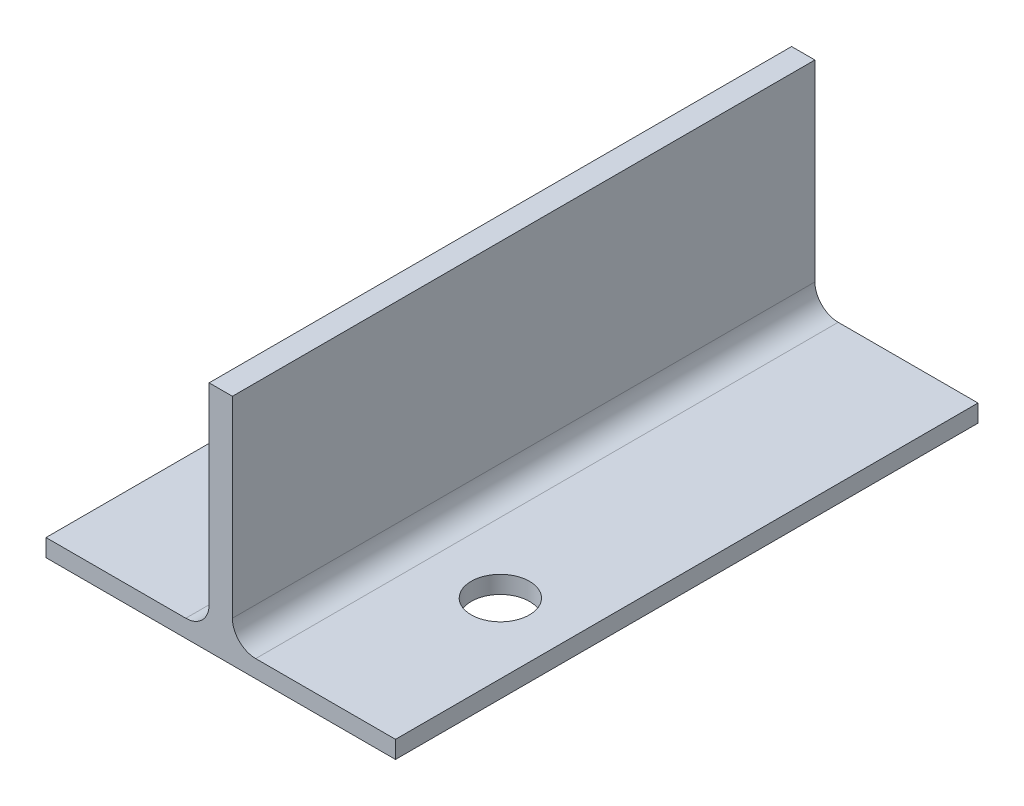
ISO-10303-21;
HEADER;
FILE_DESCRIPTION(('STEP AP214'),'2;1');
FILE_NAME('part.step','',(''),(''),'','','');
FILE_SCHEMA(('AUTOMOTIVE_DESIGN { 1 0 10303 214 1 1 1 1 }'));
ENDSEC;
DATA;
#1=APPLICATION_CONTEXT('core data for automotive mechanical design processes');
#2=APPLICATION_PROTOCOL_DEFINITION('international standard','automotive_design',2000,#1);
#3=PRODUCT_CONTEXT('',#1,'mechanical');
#4=PRODUCT('Part','Part','',(#3));
#5=PRODUCT_RELATED_PRODUCT_CATEGORY('part','',(#4));
#6=PRODUCT_DEFINITION_FORMATION('','',#4);
#7=PRODUCT_DEFINITION_CONTEXT('part definition',#1,'design');
#8=PRODUCT_DEFINITION('design','',#6,#7);
#9=PRODUCT_DEFINITION_SHAPE('','',#8);
#10=(LENGTH_UNIT() NAMED_UNIT(*) SI_UNIT(.MILLI.,.METRE.));
#11=(NAMED_UNIT(*) PLANE_ANGLE_UNIT() SI_UNIT($,.RADIAN.));
#12=(NAMED_UNIT(*) SI_UNIT($,.STERADIAN.) SOLID_ANGLE_UNIT());
#13=UNCERTAINTY_MEASURE_WITH_UNIT(LENGTH_MEASURE(1.E-05),#10,'distance_accuracy_value','');
#14=(GEOMETRIC_REPRESENTATION_CONTEXT(3) GLOBAL_UNCERTAINTY_ASSIGNED_CONTEXT((#13)) GLOBAL_UNIT_ASSIGNED_CONTEXT((#10,
#11,#12)) REPRESENTATION_CONTEXT('',''));
#15=CARTESIAN_POINT('',(0.,0.,0.));
#16=DIRECTION('',(0.,0.,1.));
#17=DIRECTION('',(1.,0.,0.));
#18=AXIS2_PLACEMENT_3D('',#15,#16,#17);
#19=CARTESIAN_POINT('',(15.,3.,25.));
#20=DIRECTION('',(-1.,0.,0.));
#21=DIRECTION('',(0.,0.,1.));
#22=AXIS2_PLACEMENT_3D('',#19,#20,#21);
#23=PLANE('',#22);
#24=DIRECTION('',(0.,1.,0.));
#25=VECTOR('',#24,1.);
#26=CARTESIAN_POINT('',(15.,3.,-25.));
#27=LINE('',#26,#25);
#28=CARTESIAN_POINT('',(15.,1.5,-25.));
#29=VERTEX_POINT('',#28);
#30=CARTESIAN_POINT('',(15.,3.,-25.));
#31=VERTEX_POINT('',#30);
#32=EDGE_CURVE('E141',#29,#31,#27,.T.);
#33=ORIENTED_EDGE('',*,*,#32,.T.);
#34=DIRECTION('',(0.,0.,-1.));
#35=VECTOR('',#34,1.);
#36=CARTESIAN_POINT('',(15.,3.,25.));
#37=LINE('',#36,#35);
#38=CARTESIAN_POINT('',(15.,3.,25.));
#39=VERTEX_POINT('',#38);
#40=EDGE_CURVE('E11',#39,#31,#37,.T.);
#41=ORIENTED_EDGE('',*,*,#40,.F.);
#42=DIRECTION('',(0.,1.,0.));
#43=VECTOR('',#42,1.);
#44=CARTESIAN_POINT('',(15.,3.,25.));
#45=LINE('',#44,#43);
#46=CARTESIAN_POINT('',(15.,1.5,25.));
#47=VERTEX_POINT('',#46);
#48=EDGE_CURVE('E160',#47,#39,#45,.T.);
#49=ORIENTED_EDGE('',*,*,#48,.F.);
#50=DIRECTION('',(0.,0.,-1.));
#51=VECTOR('',#50,1.);
#52=CARTESIAN_POINT('',(15.,1.5,25.));
#53=LINE('',#52,#51);
#54=EDGE_CURVE('E137',#47,#29,#53,.T.);
#55=ORIENTED_EDGE('',*,*,#54,.T.);
#56=EDGE_LOOP('',(#33,#41,#49,#55));
#57=FACE_BOUND('',#56,.T.);
#58=ADVANCED_FACE('F33',(#57),#23,.F.);
#59=CARTESIAN_POINT('',(3.00000000000002,3.,25.));
#60=DIRECTION('',(0.,-1.,0.));
#61=DIRECTION('',(0.,0.,-1.));
#62=AXIS2_PLACEMENT_3D('',#59,#60,#61);
#63=PLANE('',#62);
#64=CARTESIAN_POINT('',(9.,3.,10.));
#65=DIRECTION('',(0.,1.,0.));
#66=DIRECTION('',(0.,0.,1.));
#67=AXIS2_PLACEMENT_3D('',#64,#65,#66);
#68=CIRCLE('',#67,2.5);
#69=CARTESIAN_POINT('',(9.,3.,12.5));
#70=VERTEX_POINT('',#69);
#71=EDGE_CURVE('E207',#70,#70,#68,.T.);
#72=ORIENTED_EDGE('',*,*,#71,.F.);
#73=EDGE_LOOP('',(#72));
#74=FACE_BOUND('',#73,.T.);
#75=DIRECTION('',(-1.,0.,0.));
#76=VECTOR('',#75,1.);
#77=CARTESIAN_POINT('',(3.00000000000002,3.,-25.));
#78=LINE('',#77,#76);
#79=CARTESIAN_POINT('',(3.00000000000001,3.,-25.));
#80=VERTEX_POINT('',#79);
#81=EDGE_CURVE('E144',#31,#80,#78,.T.);
#82=ORIENTED_EDGE('',*,*,#81,.T.);
#83=DIRECTION('',(0.,0.,-1.));
#84=VECTOR('',#83,1.);
#85=CARTESIAN_POINT('',(3.00000000000001,3.,25.));
#86=LINE('',#85,#84);
#87=CARTESIAN_POINT('',(3.00000000000001,3.,25.));
#88=VERTEX_POINT('',#87);
#89=EDGE_CURVE('E41',#88,#80,#86,.T.);
#90=ORIENTED_EDGE('',*,*,#89,.F.);
#91=DIRECTION('',(-1.,0.,0.));
#92=VECTOR('',#91,1.);
#93=CARTESIAN_POINT('',(3.00000000000002,3.,25.));
#94=LINE('',#93,#92);
#95=EDGE_CURVE('E98',#39,#88,#94,.T.);
#96=ORIENTED_EDGE('',*,*,#95,.F.);
#97=ORIENTED_EDGE('',*,*,#40,.T.);
#98=EDGE_LOOP('',(#82,#90,#96,#97));
#99=FACE_BOUND('',#98,.T.);
#100=ADVANCED_FACE('F234',(#74,#99),#63,.F.);
#101=CARTESIAN_POINT('',(3.,5.,25.));
#102=DIRECTION('',(0.,0.,-1.));
#103=DIRECTION('',(-1.,0.,0.));
#104=AXIS2_PLACEMENT_3D('',#101,#102,#103);
#105=CYLINDRICAL_SURFACE('',#104,2.);
#106=CARTESIAN_POINT('',(3.,5.,-25.));
#107=DIRECTION('',(0.,0.,-1.));
#108=DIRECTION('',(1.,0.,0.));
#109=AXIS2_PLACEMENT_3D('',#106,#107,#108);
#110=CIRCLE('',#109,2.);
#111=CARTESIAN_POINT('',(1.,5.00000000000001,-25.));
#112=VERTEX_POINT('',#111);
#113=EDGE_CURVE('E147',#80,#112,#110,.T.);
#114=ORIENTED_EDGE('',*,*,#113,.T.);
#115=DIRECTION('',(0.,0.,-1.));
#116=VECTOR('',#115,1.);
#117=CARTESIAN_POINT('',(1.,5.00000000000001,25.));
#118=LINE('',#117,#116);
#119=CARTESIAN_POINT('',(1.,5.00000000000001,25.));
#120=VERTEX_POINT('',#119);
#121=EDGE_CURVE('E173',#120,#112,#118,.T.);
#122=ORIENTED_EDGE('',*,*,#121,.F.);
#123=CARTESIAN_POINT('',(3.,5.,25.));
#124=DIRECTION('',(0.,0.,-1.));
#125=DIRECTION('',(1.,0.,0.));
#126=AXIS2_PLACEMENT_3D('',#123,#124,#125);
#127=CIRCLE('',#126,2.);
#128=EDGE_CURVE('E181',#88,#120,#127,.T.);
#129=ORIENTED_EDGE('',*,*,#128,.F.);
#130=ORIENTED_EDGE('',*,*,#89,.T.);
#131=EDGE_LOOP('',(#114,#122,#129,#130));
#132=FACE_BOUND('',#131,.T.);
#133=ADVANCED_FACE('F179',(#132),#105,.F.);
#134=CARTESIAN_POINT('',(1.,21.5,25.));
#135=DIRECTION('',(-1.,0.,0.));
#136=DIRECTION('',(0.,0.,1.));
#137=AXIS2_PLACEMENT_3D('',#134,#135,#136);
#138=PLANE('',#137);
#139=DIRECTION('',(0.,1.,0.));
#140=VECTOR('',#139,1.);
#141=CARTESIAN_POINT('',(1.,21.5,-25.));
#142=LINE('',#141,#140);
#143=CARTESIAN_POINT('',(1.,21.5,-25.));
#144=VERTEX_POINT('',#143);
#145=EDGE_CURVE('E149',#112,#144,#142,.T.);
#146=ORIENTED_EDGE('',*,*,#145,.T.);
#147=DIRECTION('',(0.,0.,-1.));
#148=VECTOR('',#147,1.);
#149=CARTESIAN_POINT('',(1.,21.5,25.));
#150=LINE('',#149,#148);
#151=CARTESIAN_POINT('',(1.,21.5,25.));
#152=VERTEX_POINT('',#151);
#153=EDGE_CURVE('E170',#152,#144,#150,.T.);
#154=ORIENTED_EDGE('',*,*,#153,.F.);
#155=DIRECTION('',(0.,1.,0.));
#156=VECTOR('',#155,1.);
#157=CARTESIAN_POINT('',(1.,21.5,25.));
#158=LINE('',#157,#156);
#159=EDGE_CURVE('E199',#120,#152,#158,.T.);
#160=ORIENTED_EDGE('',*,*,#159,.F.);
#161=ORIENTED_EDGE('',*,*,#121,.T.);
#162=EDGE_LOOP('',(#146,#154,#160,#161));
#163=FACE_BOUND('',#162,.T.);
#164=ADVANCED_FACE('F190',(#163),#138,.F.);
#165=CARTESIAN_POINT('',(-0.999999999999999,21.5,25.));
#166=DIRECTION('',(0.,-1.,0.));
#167=DIRECTION('',(0.,0.,-1.));
#168=AXIS2_PLACEMENT_3D('',#165,#166,#167);
#169=PLANE('',#168);
#170=DIRECTION('',(-1.,0.,0.));
#171=VECTOR('',#170,1.);
#172=CARTESIAN_POINT('',(-0.999999999999999,21.5,-25.));
#173=LINE('',#172,#171);
#174=CARTESIAN_POINT('',(-0.999999999999999,21.5,-25.));
#175=VERTEX_POINT('',#174);
#176=EDGE_CURVE('E151',#144,#175,#173,.T.);
#177=ORIENTED_EDGE('',*,*,#176,.T.);
#178=DIRECTION('',(0.,0.,-1.));
#179=VECTOR('',#178,1.);
#180=CARTESIAN_POINT('',(-0.999999999999999,21.5,25.));
#181=LINE('',#180,#179);
#182=CARTESIAN_POINT('',(-0.999999999999999,21.5,25.));
#183=VERTEX_POINT('',#182);
#184=EDGE_CURVE('E167',#183,#175,#181,.T.);
#185=ORIENTED_EDGE('',*,*,#184,.F.);
#186=DIRECTION('',(-1.,0.,0.));
#187=VECTOR('',#186,1.);
#188=CARTESIAN_POINT('',(-0.999999999999999,21.5,25.));
#189=LINE('',#188,#187);
#190=EDGE_CURVE('E196',#152,#183,#189,.T.);
#191=ORIENTED_EDGE('',*,*,#190,.F.);
#192=ORIENTED_EDGE('',*,*,#153,.T.);
#193=EDGE_LOOP('',(#177,#185,#191,#192));
#194=FACE_BOUND('',#193,.T.);
#195=ADVANCED_FACE('F194',(#194),#169,.F.);
#196=CARTESIAN_POINT('',(-0.999999999999999,5.00000000000001,25.));
#197=DIRECTION('',(1.,0.,0.));
#198=DIRECTION('',(0.,0.,-1.));
#199=AXIS2_PLACEMENT_3D('',#196,#197,#198);
#200=PLANE('',#199);
#201=DIRECTION('',(0.,-1.,0.));
#202=VECTOR('',#201,1.);
#203=CARTESIAN_POINT('',(-0.999999999999999,5.00000000000001,-25.));
#204=LINE('',#203,#202);
#205=CARTESIAN_POINT('',(-1.,5.,-25.));
#206=VERTEX_POINT('',#205);
#207=EDGE_CURVE('E153',#175,#206,#204,.T.);
#208=ORIENTED_EDGE('',*,*,#207,.T.);
#209=DIRECTION('',(0.,0.,-1.));
#210=VECTOR('',#209,1.);
#211=CARTESIAN_POINT('',(-1.,5.,25.));
#212=LINE('',#211,#210);
#213=CARTESIAN_POINT('',(-1.,5.,25.));
#214=VERTEX_POINT('',#213);
#215=EDGE_CURVE('E164',#214,#206,#212,.T.);
#216=ORIENTED_EDGE('',*,*,#215,.F.);
#217=DIRECTION('',(0.,-1.,0.));
#218=VECTOR('',#217,1.);
#219=CARTESIAN_POINT('',(-0.999999999999999,5.00000000000001,25.));
#220=LINE('',#219,#218);
#221=EDGE_CURVE('E198',#183,#214,#220,.T.);
#222=ORIENTED_EDGE('',*,*,#221,.F.);
#223=ORIENTED_EDGE('',*,*,#184,.T.);
#224=EDGE_LOOP('',(#208,#216,#222,#223));
#225=FACE_BOUND('',#224,.T.);
#226=ADVANCED_FACE('F244',(#225),#200,.F.);
#227=CARTESIAN_POINT('',(-3.,5.,25.));
#228=DIRECTION('',(0.,0.,-1.));
#229=DIRECTION('',(-1.,0.,0.));
#230=AXIS2_PLACEMENT_3D('',#227,#228,#229);
#231=CYLINDRICAL_SURFACE('',#230,2.);
#232=CARTESIAN_POINT('',(-3.,5.,-25.));
#233=DIRECTION('',(0.,0.,-1.));
#234=DIRECTION('',(1.,0.,0.));
#235=AXIS2_PLACEMENT_3D('',#232,#233,#234);
#236=CIRCLE('',#235,2.);
#237=CARTESIAN_POINT('',(-3.00000000000001,3.,-25.));
#238=VERTEX_POINT('',#237);
#239=EDGE_CURVE('E155',#206,#238,#236,.T.);
#240=ORIENTED_EDGE('',*,*,#239,.T.);
#241=DIRECTION('',(0.,0.,-1.));
#242=VECTOR('',#241,1.);
#243=CARTESIAN_POINT('',(-3.00000000000001,3.,25.));
#244=LINE('',#243,#242);
#245=CARTESIAN_POINT('',(-3.00000000000001,3.,25.));
#246=VERTEX_POINT('',#245);
#247=EDGE_CURVE('E132',#246,#238,#244,.T.);
#248=ORIENTED_EDGE('',*,*,#247,.F.);
#249=CARTESIAN_POINT('',(-3.,5.,25.));
#250=DIRECTION('',(0.,0.,-1.));
#251=DIRECTION('',(1.,0.,0.));
#252=AXIS2_PLACEMENT_3D('',#249,#250,#251);
#253=CIRCLE('',#252,2.);
#254=EDGE_CURVE('E123',#214,#246,#253,.T.);
#255=ORIENTED_EDGE('',*,*,#254,.F.);
#256=ORIENTED_EDGE('',*,*,#215,.T.);
#257=EDGE_LOOP('',(#240,#248,#255,#256));
#258=FACE_BOUND('',#257,.T.);
#259=ADVANCED_FACE('F241',(#258),#231,.F.);
#260=CARTESIAN_POINT('',(-15.,3.,25.));
#261=DIRECTION('',(0.,-1.,0.));
#262=DIRECTION('',(0.,0.,-1.));
#263=AXIS2_PLACEMENT_3D('',#260,#261,#262);
#264=PLANE('',#263);
#265=CARTESIAN_POINT('',(-9.,3.,10.));
#266=DIRECTION('',(0.,-1.,0.));
#267=DIRECTION('',(0.,0.,1.));
#268=AXIS2_PLACEMENT_3D('',#265,#266,#267);
#269=CIRCLE('',#268,2.5);
#270=CARTESIAN_POINT('',(-9.,3.,12.5));
#271=VERTEX_POINT('',#270);
#272=EDGE_CURVE('E213',#271,#271,#269,.T.);
#273=ORIENTED_EDGE('',*,*,#272,.T.);
#274=EDGE_LOOP('',(#273));
#275=FACE_BOUND('',#274,.T.);
#276=DIRECTION('',(-1.,0.,0.));
#277=VECTOR('',#276,1.);
#278=CARTESIAN_POINT('',(-15.,3.,-25.));
#279=LINE('',#278,#277);
#280=CARTESIAN_POINT('',(-15.,3.,-25.));
#281=VERTEX_POINT('',#280);
#282=EDGE_CURVE('E131',#238,#281,#279,.T.);
#283=ORIENTED_EDGE('',*,*,#282,.T.);
#284=DIRECTION('',(0.,0.,-1.));
#285=VECTOR('',#284,1.);
#286=CARTESIAN_POINT('',(-15.,3.,25.));
#287=LINE('',#286,#285);
#288=CARTESIAN_POINT('',(-15.,3.,25.));
#289=VERTEX_POINT('',#288);
#290=EDGE_CURVE('E128',#289,#281,#287,.T.);
#291=ORIENTED_EDGE('',*,*,#290,.F.);
#292=DIRECTION('',(-1.,0.,0.));
#293=VECTOR('',#292,1.);
#294=CARTESIAN_POINT('',(-15.,3.,25.));
#295=LINE('',#294,#293);
#296=EDGE_CURVE('E117',#246,#289,#295,.T.);
#297=ORIENTED_EDGE('',*,*,#296,.F.);
#298=ORIENTED_EDGE('',*,*,#247,.T.);
#299=EDGE_LOOP('',(#283,#291,#297,#298));
#300=FACE_BOUND('',#299,.T.);
#301=ADVANCED_FACE('F129',(#275,#300),#264,.F.);
#302=CARTESIAN_POINT('',(-15.,1.5,25.));
#303=DIRECTION('',(1.,0.,0.));
#304=DIRECTION('',(0.,0.,-1.));
#305=AXIS2_PLACEMENT_3D('',#302,#303,#304);
#306=PLANE('',#305);
#307=DIRECTION('',(0.,-1.,0.));
#308=VECTOR('',#307,1.);
#309=CARTESIAN_POINT('',(-15.,1.5,-25.));
#310=LINE('',#309,#308);
#311=CARTESIAN_POINT('',(-15.,1.5,-25.));
#312=VERTEX_POINT('',#311);
#313=EDGE_CURVE('E84',#281,#312,#310,.T.);
#314=ORIENTED_EDGE('',*,*,#313,.T.);
#315=DIRECTION('',(0.,0.,-1.));
#316=VECTOR('',#315,1.);
#317=CARTESIAN_POINT('',(-15.,1.5,25.));
#318=LINE('',#317,#316);
#319=CARTESIAN_POINT('',(-15.,1.5,25.));
#320=VERTEX_POINT('',#319);
#321=EDGE_CURVE('E133',#320,#312,#318,.T.);
#322=ORIENTED_EDGE('',*,*,#321,.F.);
#323=DIRECTION('',(0.,-1.,0.));
#324=VECTOR('',#323,1.);
#325=CARTESIAN_POINT('',(-15.,1.5,25.));
#326=LINE('',#325,#324);
#327=EDGE_CURVE('E121',#289,#320,#326,.T.);
#328=ORIENTED_EDGE('',*,*,#327,.F.);
#329=ORIENTED_EDGE('',*,*,#290,.T.);
#330=EDGE_LOOP('',(#314,#322,#328,#329));
#331=FACE_BOUND('',#330,.T.);
#332=ADVANCED_FACE('F135',(#331),#306,.F.);
#333=CARTESIAN_POINT('',(15.,1.5,25.));
#334=DIRECTION('',(0.,1.,0.));
#335=DIRECTION('',(0.,0.,1.));
#336=AXIS2_PLACEMENT_3D('',#333,#334,#335);
#337=PLANE('',#336);
#338=CARTESIAN_POINT('',(-9.,1.5,10.));
#339=DIRECTION('',(0.,-1.,0.));
#340=DIRECTION('',(0.,0.,1.));
#341=AXIS2_PLACEMENT_3D('',#338,#339,#340);
#342=CIRCLE('',#341,2.5);
#343=CARTESIAN_POINT('',(-9.,1.5,12.5));
#344=VERTEX_POINT('',#343);
#345=EDGE_CURVE('E210',#344,#344,#342,.T.);
#346=ORIENTED_EDGE('',*,*,#345,.F.);
#347=EDGE_LOOP('',(#346));
#348=FACE_BOUND('',#347,.T.);
#349=CARTESIAN_POINT('',(9.,1.5,10.));
#350=DIRECTION('',(0.,1.,0.));
#351=DIRECTION('',(0.,0.,1.));
#352=AXIS2_PLACEMENT_3D('',#349,#350,#351);
#353=CIRCLE('',#352,2.5);
#354=CARTESIAN_POINT('',(9.,1.5,12.5));
#355=VERTEX_POINT('',#354);
#356=EDGE_CURVE('E145',#355,#355,#353,.T.);
#357=ORIENTED_EDGE('',*,*,#356,.T.);
#358=EDGE_LOOP('',(#357));
#359=FACE_BOUND('',#358,.T.);
#360=DIRECTION('',(1.,0.,0.));
#361=VECTOR('',#360,1.);
#362=CARTESIAN_POINT('',(15.,1.5,-25.));
#363=LINE('',#362,#361);
#364=EDGE_CURVE('E90',#312,#29,#363,.T.);
#365=ORIENTED_EDGE('',*,*,#364,.T.);
#366=ORIENTED_EDGE('',*,*,#54,.F.);
#367=DIRECTION('',(1.,0.,0.));
#368=VECTOR('',#367,1.);
#369=CARTESIAN_POINT('',(15.,1.5,25.));
#370=LINE('',#369,#368);
#371=EDGE_CURVE('E49',#320,#47,#370,.T.);
#372=ORIENTED_EDGE('',*,*,#371,.F.);
#373=ORIENTED_EDGE('',*,*,#321,.T.);
#374=EDGE_LOOP('',(#365,#366,#372,#373));
#375=FACE_BOUND('',#374,.T.);
#376=ADVANCED_FACE('F222',(#348,#359,#375),#337,.F.);
#377=CARTESIAN_POINT('',(-3.,5.,25.));
#378=DIRECTION('',(0.,0.,1.));
#379=DIRECTION('',(1.,0.,0.));
#380=AXIS2_PLACEMENT_3D('',#377,#378,#379);
#381=PLANE('',#380);
#382=ORIENTED_EDGE('',*,*,#48,.T.);
#383=ORIENTED_EDGE('',*,*,#95,.T.);
#384=ORIENTED_EDGE('',*,*,#128,.T.);
#385=ORIENTED_EDGE('',*,*,#159,.T.);
#386=ORIENTED_EDGE('',*,*,#190,.T.);
#387=ORIENTED_EDGE('',*,*,#221,.T.);
#388=ORIENTED_EDGE('',*,*,#254,.T.);
#389=ORIENTED_EDGE('',*,*,#296,.T.);
#390=ORIENTED_EDGE('',*,*,#327,.T.);
#391=ORIENTED_EDGE('',*,*,#371,.T.);
#392=EDGE_LOOP('',(#382,#383,#384,#385,#386,#387,#388,#389,#390,#391));
#393=FACE_BOUND('',#392,.T.);
#394=ADVANCED_FACE('F119',(#393),#381,.T.);
#395=CARTESIAN_POINT('',(-3.,5.,-25.));
#396=DIRECTION('',(0.,0.,1.));
#397=DIRECTION('',(1.,0.,0.));
#398=AXIS2_PLACEMENT_3D('',#395,#396,#397);
#399=PLANE('',#398);
#400=ORIENTED_EDGE('',*,*,#32,.F.);
#401=ORIENTED_EDGE('',*,*,#364,.F.);
#402=ORIENTED_EDGE('',*,*,#313,.F.);
#403=ORIENTED_EDGE('',*,*,#282,.F.);
#404=ORIENTED_EDGE('',*,*,#239,.F.);
#405=ORIENTED_EDGE('',*,*,#207,.F.);
#406=ORIENTED_EDGE('',*,*,#176,.F.);
#407=ORIENTED_EDGE('',*,*,#145,.F.);
#408=ORIENTED_EDGE('',*,*,#113,.F.);
#409=ORIENTED_EDGE('',*,*,#81,.F.);
#410=EDGE_LOOP('',(#400,#401,#402,#403,#404,#405,#406,#407,#408,#409));
#411=FACE_BOUND('',#410,.T.);
#412=ADVANCED_FACE('F185',(#411),#399,.F.);
#413=CARTESIAN_POINT('',(9.,1.5,10.));
#414=DIRECTION('',(0.,1.,0.));
#415=DIRECTION('',(0.,0.,1.));
#416=AXIS2_PLACEMENT_3D('',#413,#414,#415);
#417=CYLINDRICAL_SURFACE('',#416,2.5);
#418=ORIENTED_EDGE('',*,*,#356,.F.);
#419=EDGE_LOOP('',(#418));
#420=FACE_BOUND('',#419,.T.);
#421=ORIENTED_EDGE('',*,*,#71,.T.);
#422=EDGE_LOOP('',(#421));
#423=FACE_BOUND('',#422,.T.);
#424=ADVANCED_FACE('F228',(#420,#423),#417,.F.);
#425=CARTESIAN_POINT('',(-9.,1.5,10.));
#426=DIRECTION('',(0.,1.,0.));
#427=DIRECTION('',(0.,0.,1.));
#428=AXIS2_PLACEMENT_3D('',#425,#426,#427);
#429=CYLINDRICAL_SURFACE('',#428,2.5);
#430=ORIENTED_EDGE('',*,*,#345,.T.);
#431=EDGE_LOOP('',(#430));
#432=FACE_BOUND('',#431,.T.);
#433=ORIENTED_EDGE('',*,*,#272,.F.);
#434=EDGE_LOOP('',(#433));
#435=FACE_BOUND('',#434,.T.);
#436=ADVANCED_FACE('F219',(#432,#435),#429,.F.);
#437=CLOSED_SHELL('',(#58,#100,#133,#164,#195,#226,#259,#301,#332,#376,#394,#412,#424,#436));
#438=MANIFOLD_SOLID_BREP('B2',#437);
#439=ADVANCED_BREP_SHAPE_REPRESENTATION('',(#18,#438),#14);
#440=SHAPE_DEFINITION_REPRESENTATION(#9,#439);
ENDSEC;
END-ISO-10303-21;
